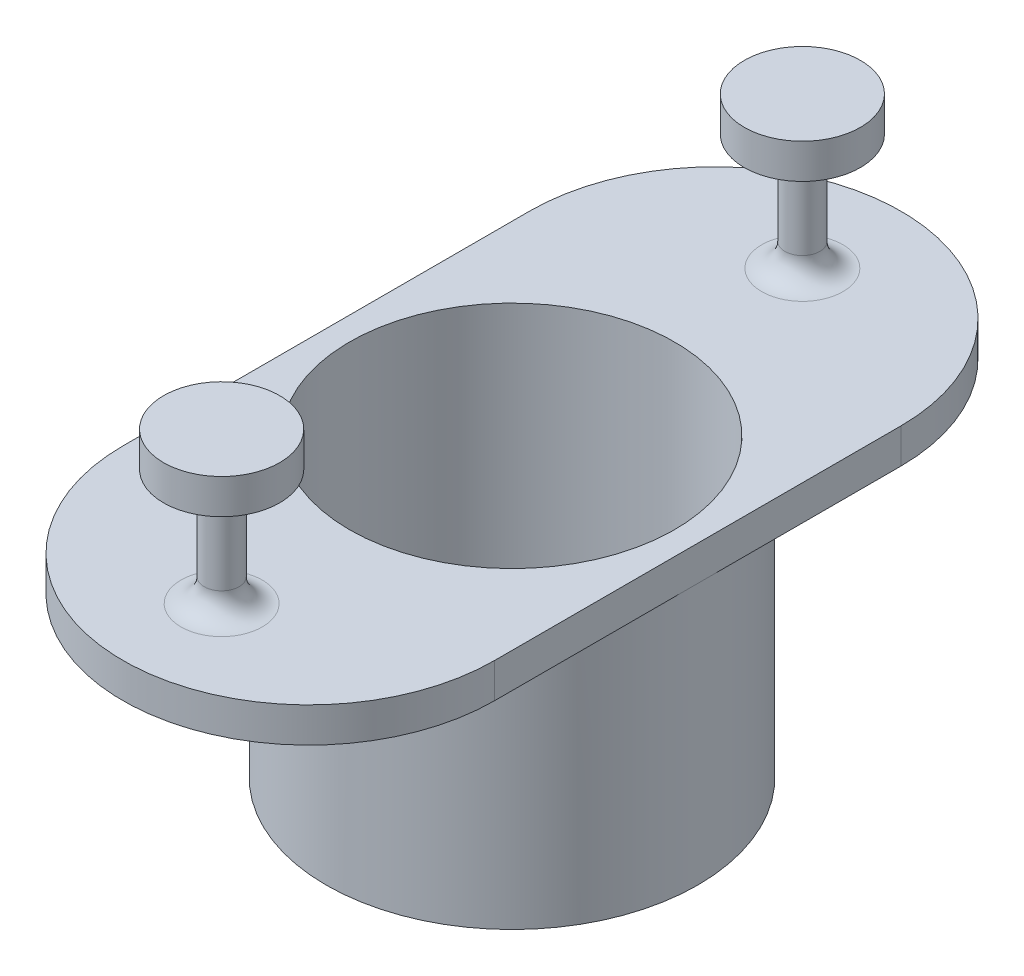
ISO-10303-21;
HEADER;
FILE_DESCRIPTION(('STEP AP214'),'2;1');
FILE_NAME('part.step','',(''),(''),'','','');
FILE_SCHEMA(('AUTOMOTIVE_DESIGN { 1 0 10303 214 1 1 1 1 }'));
ENDSEC;
DATA;
#1=APPLICATION_CONTEXT('core data for automotive mechanical design processes');
#2=APPLICATION_PROTOCOL_DEFINITION('international standard','automotive_design',2000,#1);
#3=PRODUCT_CONTEXT('',#1,'mechanical');
#4=PRODUCT('Part','Part','',(#3));
#5=PRODUCT_RELATED_PRODUCT_CATEGORY('part','',(#4));
#6=PRODUCT_DEFINITION_FORMATION('','',#4);
#7=PRODUCT_DEFINITION_CONTEXT('part definition',#1,'design');
#8=PRODUCT_DEFINITION('design','',#6,#7);
#9=PRODUCT_DEFINITION_SHAPE('','',#8);
#10=(LENGTH_UNIT() NAMED_UNIT(*) SI_UNIT(.MILLI.,.METRE.));
#11=(NAMED_UNIT(*) PLANE_ANGLE_UNIT() SI_UNIT($,.RADIAN.));
#12=(NAMED_UNIT(*) SI_UNIT($,.STERADIAN.) SOLID_ANGLE_UNIT());
#13=UNCERTAINTY_MEASURE_WITH_UNIT(LENGTH_MEASURE(1.E-05),#10,'distance_accuracy_value','');
#14=(GEOMETRIC_REPRESENTATION_CONTEXT(3) GLOBAL_UNCERTAINTY_ASSIGNED_CONTEXT((#13)) GLOBAL_UNIT_ASSIGNED_CONTEXT((#10,
#11,#12)) REPRESENTATION_CONTEXT('',''));
#15=CARTESIAN_POINT('',(0.,0.,0.));
#16=DIRECTION('',(0.,0.,1.));
#17=DIRECTION('',(1.,0.,0.));
#18=AXIS2_PLACEMENT_3D('',#15,#16,#17);
#19=CARTESIAN_POINT('',(0.,22.5,0.));
#20=DIRECTION('',(0.,-1.,0.));
#21=DIRECTION('',(0.,0.,-1.));
#22=AXIS2_PLACEMENT_3D('',#19,#20,#21);
#23=CYLINDRICAL_SURFACE('',#22,16.);
#24=CARTESIAN_POINT('',(0.,22.5,0.));
#25=DIRECTION('',(0.,1.,0.));
#26=DIRECTION('',(0.,0.,1.));
#27=AXIS2_PLACEMENT_3D('',#24,#25,#26);
#28=CIRCLE('',#27,16.);
#29=CARTESIAN_POINT('',(16.,22.5,0.));
#30=VERTEX_POINT('',#29);
#31=CARTESIAN_POINT('',(-16.,22.5,0.));
#32=VERTEX_POINT('',#31);
#33=EDGE_CURVE('E60',#30,#32,#28,.T.);
#34=ORIENTED_EDGE('',*,*,#33,.F.);
#35=EDGE_CURVE('E57',#32,#30,#28,.T.);
#36=ORIENTED_EDGE('',*,*,#35,.F.);
#37=EDGE_LOOP('',(#34,#36));
#38=FACE_BOUND('',#37,.T.);
#39=CARTESIAN_POINT('',(0.,0.,0.));
#40=DIRECTION('',(0.,1.,0.));
#41=DIRECTION('',(0.,0.,1.));
#42=AXIS2_PLACEMENT_3D('',#39,#40,#41);
#43=CIRCLE('',#42,16.);
#44=CARTESIAN_POINT('',(0.,0.,16.));
#45=VERTEX_POINT('',#44);
#46=EDGE_CURVE('E113',#45,#45,#43,.T.);
#47=ORIENTED_EDGE('',*,*,#46,.T.);
#48=EDGE_LOOP('',(#47));
#49=FACE_BOUND('',#48,.T.);
#50=ADVANCED_FACE('F43',(#38,#49),#23,.T.);
#51=CARTESIAN_POINT('',(0.,0.,0.));
#52=DIRECTION('',(0.,1.,0.));
#53=DIRECTION('',(0.,0.,1.));
#54=AXIS2_PLACEMENT_3D('',#51,#52,#53);
#55=PLANE('',#54);
#56=CARTESIAN_POINT('',(8.,0.,0.));
#57=DIRECTION('',(0.,1.,0.));
#58=DIRECTION('',(0.,0.,1.));
#59=AXIS2_PLACEMENT_3D('',#56,#57,#58);
#60=CIRCLE('',#59,1.5);
#61=CARTESIAN_POINT('',(8.,0.,1.5));
#62=VERTEX_POINT('',#61);
#63=EDGE_CURVE('E454',#62,#62,#60,.T.);
#64=ORIENTED_EDGE('',*,*,#63,.T.);
#65=EDGE_LOOP('',(#64));
#66=FACE_BOUND('',#65,.T.);
#67=CARTESIAN_POINT('',(-8.,0.,0.));
#68=DIRECTION('',(0.,1.,0.));
#69=DIRECTION('',(0.,0.,1.));
#70=AXIS2_PLACEMENT_3D('',#67,#68,#69);
#71=CIRCLE('',#70,1.5);
#72=CARTESIAN_POINT('',(-8.,0.,1.5));
#73=VERTEX_POINT('',#72);
#74=EDGE_CURVE('E458',#73,#73,#71,.T.);
#75=ORIENTED_EDGE('',*,*,#74,.T.);
#76=EDGE_LOOP('',(#75));
#77=FACE_BOUND('',#76,.T.);
#78=ORIENTED_EDGE('',*,*,#46,.F.);
#79=EDGE_LOOP('',(#78));
#80=FACE_BOUND('',#79,.T.);
#81=ADVANCED_FACE('F165',(#66,#77,#80),#55,.F.);
#82=CARTESIAN_POINT('',(0.,22.5,17.5));
#83=DIRECTION('',(0.,1.,0.));
#84=DIRECTION('',(0.,0.,1.));
#85=AXIS2_PLACEMENT_3D('',#82,#83,#84);
#86=PLANE('',#85);
#87=DIRECTION('',(0.,0.,-1.));
#88=VECTOR('',#87,1.);
#89=CARTESIAN_POINT('',(16.,22.5,17.5));
#90=LINE('',#89,#88);
#91=CARTESIAN_POINT('',(16.,22.5,-17.5));
#92=VERTEX_POINT('',#91);
#93=EDGE_CURVE('E430',#30,#92,#90,.T.);
#94=ORIENTED_EDGE('',*,*,#93,.F.);
#95=ORIENTED_EDGE('',*,*,#33,.T.);
#96=DIRECTION('',(0.,0.,1.));
#97=VECTOR('',#96,1.);
#98=CARTESIAN_POINT('',(-16.,22.5,17.5));
#99=LINE('',#98,#97);
#100=CARTESIAN_POINT('',(-16.,22.5,-17.5));
#101=VERTEX_POINT('',#100);
#102=EDGE_CURVE('E108',#101,#32,#99,.T.);
#103=ORIENTED_EDGE('',*,*,#102,.F.);
#104=CARTESIAN_POINT('',(0.,22.5,-17.5));
#105=DIRECTION('',(0.,1.,0.));
#106=DIRECTION('',(0.,0.,1.));
#107=AXIS2_PLACEMENT_3D('',#104,#105,#106);
#108=CIRCLE('',#107,16.);
#109=EDGE_CURVE('E433',#92,#101,#108,.T.);
#110=ORIENTED_EDGE('',*,*,#109,.F.);
#111=EDGE_LOOP('',(#94,#95,#103,#110));
#112=FACE_BOUND('',#111,.T.);
#113=ADVANCED_FACE('F170',(#112),#86,.F.);
#114=CARTESIAN_POINT('',(-16.,22.5,17.5));
#115=VERTEX_POINT('',#114);
#116=EDGE_CURVE('E436',#32,#115,#99,.T.);
#117=ORIENTED_EDGE('',*,*,#116,.F.);
#118=ORIENTED_EDGE('',*,*,#35,.T.);
#119=CARTESIAN_POINT('',(16.,22.5,17.5));
#120=VERTEX_POINT('',#119);
#121=EDGE_CURVE('E434',#120,#30,#90,.T.);
#122=ORIENTED_EDGE('',*,*,#121,.F.);
#123=CARTESIAN_POINT('',(0.,22.5,17.5));
#124=DIRECTION('',(0.,1.,0.));
#125=DIRECTION('',(0.,0.,1.));
#126=AXIS2_PLACEMENT_3D('',#123,#124,#125);
#127=CIRCLE('',#126,16.);
#128=EDGE_CURVE('E112',#115,#120,#127,.T.);
#129=ORIENTED_EDGE('',*,*,#128,.F.);
#130=EDGE_LOOP('',(#117,#118,#122,#129));
#131=FACE_BOUND('',#130,.T.);
#132=ADVANCED_FACE('F387',(#131),#86,.F.);
#133=CARTESIAN_POINT('',(0.,25.5,17.5));
#134=DIRECTION('',(0.,-1.,0.));
#135=DIRECTION('',(0.,0.,-1.));
#136=AXIS2_PLACEMENT_3D('',#133,#134,#135);
#137=CYLINDRICAL_SURFACE('',#136,16.);
#138=ORIENTED_EDGE('',*,*,#128,.T.);
#139=DIRECTION('',(0.,-1.,0.));
#140=VECTOR('',#139,1.);
#141=CARTESIAN_POINT('',(16.,25.5,17.5));
#142=LINE('',#141,#140);
#143=CARTESIAN_POINT('',(16.,25.5,17.5));
#144=VERTEX_POINT('',#143);
#145=EDGE_CURVE('E92',#144,#120,#142,.T.);
#146=ORIENTED_EDGE('',*,*,#145,.F.);
#147=CARTESIAN_POINT('',(0.,25.5,17.5));
#148=DIRECTION('',(0.,1.,0.));
#149=DIRECTION('',(0.,0.,1.));
#150=AXIS2_PLACEMENT_3D('',#147,#148,#149);
#151=CIRCLE('',#150,16.);
#152=CARTESIAN_POINT('',(-16.,25.5,17.5));
#153=VERTEX_POINT('',#152);
#154=EDGE_CURVE('E99',#153,#144,#151,.T.);
#155=ORIENTED_EDGE('',*,*,#154,.F.);
#156=DIRECTION('',(0.,-1.,0.));
#157=VECTOR('',#156,1.);
#158=CARTESIAN_POINT('',(-16.,25.5,17.5));
#159=LINE('',#158,#157);
#160=EDGE_CURVE('E443',#153,#115,#159,.T.);
#161=ORIENTED_EDGE('',*,*,#160,.T.);
#162=EDGE_LOOP('',(#138,#146,#155,#161));
#163=FACE_BOUND('',#162,.T.);
#164=ADVANCED_FACE('F110',(#163),#137,.T.);
#165=CARTESIAN_POINT('',(16.,25.5,17.5));
#166=DIRECTION('',(-1.,0.,0.));
#167=DIRECTION('',(0.,0.,1.));
#168=AXIS2_PLACEMENT_3D('',#165,#166,#167);
#169=PLANE('',#168);
#170=ORIENTED_EDGE('',*,*,#121,.T.);
#171=ORIENTED_EDGE('',*,*,#93,.T.);
#172=DIRECTION('',(0.,-1.,0.));
#173=VECTOR('',#172,1.);
#174=CARTESIAN_POINT('',(16.,25.5,-17.5));
#175=LINE('',#174,#173);
#176=CARTESIAN_POINT('',(16.,25.5,-17.5));
#177=VERTEX_POINT('',#176);
#178=EDGE_CURVE('E95',#177,#92,#175,.T.);
#179=ORIENTED_EDGE('',*,*,#178,.F.);
#180=DIRECTION('',(0.,0.,-1.));
#181=VECTOR('',#180,1.);
#182=CARTESIAN_POINT('',(16.,25.5,17.5));
#183=LINE('',#182,#181);
#184=EDGE_CURVE('E87',#144,#177,#183,.T.);
#185=ORIENTED_EDGE('',*,*,#184,.F.);
#186=ORIENTED_EDGE('',*,*,#145,.T.);
#187=EDGE_LOOP('',(#170,#171,#179,#185,#186));
#188=FACE_BOUND('',#187,.T.);
#189=ADVANCED_FACE('F90',(#188),#169,.F.);
#190=CARTESIAN_POINT('',(0.,25.5,-17.5));
#191=DIRECTION('',(0.,-1.,0.));
#192=DIRECTION('',(0.,0.,-1.));
#193=AXIS2_PLACEMENT_3D('',#190,#191,#192);
#194=CYLINDRICAL_SURFACE('',#193,16.);
#195=ORIENTED_EDGE('',*,*,#109,.T.);
#196=DIRECTION('',(0.,-1.,0.));
#197=VECTOR('',#196,1.);
#198=CARTESIAN_POINT('',(-16.,25.5,-17.5));
#199=LINE('',#198,#197);
#200=CARTESIAN_POINT('',(-16.,25.5,-17.5));
#201=VERTEX_POINT('',#200);
#202=EDGE_CURVE('E117',#201,#101,#199,.T.);
#203=ORIENTED_EDGE('',*,*,#202,.F.);
#204=CARTESIAN_POINT('',(0.,25.5,-17.5));
#205=DIRECTION('',(0.,1.,0.));
#206=DIRECTION('',(0.,0.,1.));
#207=AXIS2_PLACEMENT_3D('',#204,#205,#206);
#208=CIRCLE('',#207,16.);
#209=EDGE_CURVE('E98',#177,#201,#208,.T.);
#210=ORIENTED_EDGE('',*,*,#209,.F.);
#211=ORIENTED_EDGE('',*,*,#178,.T.);
#212=EDGE_LOOP('',(#195,#203,#210,#211));
#213=FACE_BOUND('',#212,.T.);
#214=ADVANCED_FACE('F357',(#213),#194,.T.);
#215=CARTESIAN_POINT('',(-16.,25.5,17.5));
#216=DIRECTION('',(1.,0.,0.));
#217=DIRECTION('',(0.,0.,-1.));
#218=AXIS2_PLACEMENT_3D('',#215,#216,#217);
#219=PLANE('',#218);
#220=ORIENTED_EDGE('',*,*,#102,.T.);
#221=ORIENTED_EDGE('',*,*,#116,.T.);
#222=ORIENTED_EDGE('',*,*,#160,.F.);
#223=DIRECTION('',(0.,0.,1.));
#224=VECTOR('',#223,1.);
#225=CARTESIAN_POINT('',(-16.,25.5,17.5));
#226=LINE('',#225,#224);
#227=EDGE_CURVE('E104',#201,#153,#226,.T.);
#228=ORIENTED_EDGE('',*,*,#227,.F.);
#229=ORIENTED_EDGE('',*,*,#202,.T.);
#230=EDGE_LOOP('',(#220,#221,#222,#228,#229));
#231=FACE_BOUND('',#230,.T.);
#232=ADVANCED_FACE('F161',(#231),#219,.F.);
#233=CARTESIAN_POINT('',(0.,25.5,17.5));
#234=DIRECTION('',(0.,1.,0.));
#235=DIRECTION('',(0.,0.,1.));
#236=AXIS2_PLACEMENT_3D('',#233,#234,#235);
#237=PLANE('',#236);
#238=CARTESIAN_POINT('',(0.,25.5,25.));
#239=DIRECTION('',(0.,1.,0.));
#240=DIRECTION('',(0.,0.,1.));
#241=AXIS2_PLACEMENT_3D('',#238,#239,#240);
#242=CIRCLE('',#241,3.5);
#243=CARTESIAN_POINT('',(0.,25.5,28.5));
#244=VERTEX_POINT('',#243);
#245=EDGE_CURVE('E12',#244,#244,#242,.F.);
#246=ORIENTED_EDGE('',*,*,#245,.T.);
#247=EDGE_LOOP('',(#246));
#248=FACE_BOUND('',#247,.T.);
#249=CARTESIAN_POINT('',(0.,25.5,-25.));
#250=DIRECTION('',(0.,1.,0.));
#251=DIRECTION('',(0.,0.,1.));
#252=AXIS2_PLACEMENT_3D('',#249,#250,#251);
#253=CIRCLE('',#252,3.50000000000001);
#254=CARTESIAN_POINT('',(0.,25.5,-21.5));
#255=VERTEX_POINT('',#254);
#256=EDGE_CURVE('E51',#255,#255,#253,.F.);
#257=ORIENTED_EDGE('',*,*,#256,.T.);
#258=EDGE_LOOP('',(#257));
#259=FACE_BOUND('',#258,.T.);
#260=CARTESIAN_POINT('',(0.,25.5,0.));
#261=DIRECTION('',(0.,1.,0.));
#262=DIRECTION('',(0.,0.,1.));
#263=AXIS2_PLACEMENT_3D('',#260,#261,#262);
#264=CIRCLE('',#263,14.);
#265=CARTESIAN_POINT('',(0.,25.5,14.));
#266=VERTEX_POINT('',#265);
#267=EDGE_CURVE('E451',#266,#266,#264,.T.);
#268=ORIENTED_EDGE('',*,*,#267,.F.);
#269=EDGE_LOOP('',(#268));
#270=FACE_BOUND('',#269,.T.);
#271=ORIENTED_EDGE('',*,*,#154,.T.);
#272=ORIENTED_EDGE('',*,*,#184,.T.);
#273=ORIENTED_EDGE('',*,*,#209,.T.);
#274=ORIENTED_EDGE('',*,*,#227,.T.);
#275=EDGE_LOOP('',(#271,#272,#273,#274));
#276=FACE_BOUND('',#275,.T.);
#277=ADVANCED_FACE('F102',(#248,#259,#270,#276),#237,.T.);
#278=CARTESIAN_POINT('',(0.,35.5,-25.));
#279=DIRECTION('',(0.,-1.,0.));
#280=DIRECTION('',(0.,0.,-1.));
#281=AXIS2_PLACEMENT_3D('',#278,#279,#280);
#282=CYLINDRICAL_SURFACE('',#281,1.50000000000001);
#283=CARTESIAN_POINT('',(0.,33.5,-25.));
#284=DIRECTION('',(0.,1.,0.));
#285=DIRECTION('',(0.,0.,1.));
#286=AXIS2_PLACEMENT_3D('',#283,#284,#285);
#287=CIRCLE('',#286,1.50000000000001);
#288=CARTESIAN_POINT('',(0.,33.5,-23.5));
#289=VERTEX_POINT('',#288);
#290=EDGE_CURVE('E128',#289,#289,#287,.F.);
#291=ORIENTED_EDGE('',*,*,#290,.T.);
#292=EDGE_LOOP('',(#291));
#293=FACE_BOUND('',#292,.T.);
#294=CARTESIAN_POINT('',(0.,27.5,-25.));
#295=DIRECTION('',(0.,1.,0.));
#296=DIRECTION('',(0.,0.,1.));
#297=AXIS2_PLACEMENT_3D('',#294,#295,#296);
#298=CIRCLE('',#297,1.50000000000001);
#299=CARTESIAN_POINT('',(0.,27.5,-23.5));
#300=VERTEX_POINT('',#299);
#301=EDGE_CURVE('E125',#300,#300,#298,.T.);
#302=ORIENTED_EDGE('',*,*,#301,.T.);
#303=EDGE_LOOP('',(#302));
#304=FACE_BOUND('',#303,.T.);
#305=ADVANCED_FACE('F149',(#293,#304),#282,.T.);
#306=CARTESIAN_POINT('',(0.,35.5,25.));
#307=DIRECTION('',(0.,-1.,0.));
#308=DIRECTION('',(0.,0.,-1.));
#309=AXIS2_PLACEMENT_3D('',#306,#307,#308);
#310=CYLINDRICAL_SURFACE('',#309,1.5);
#311=CARTESIAN_POINT('',(0.,33.5,25.));
#312=DIRECTION('',(0.,1.,0.));
#313=DIRECTION('',(0.,0.,1.));
#314=AXIS2_PLACEMENT_3D('',#311,#312,#313);
#315=CIRCLE('',#314,1.5);
#316=CARTESIAN_POINT('',(0.,33.5,26.5));
#317=VERTEX_POINT('',#316);
#318=EDGE_CURVE('E137',#317,#317,#315,.F.);
#319=ORIENTED_EDGE('',*,*,#318,.T.);
#320=EDGE_LOOP('',(#319));
#321=FACE_BOUND('',#320,.T.);
#322=CARTESIAN_POINT('',(0.,27.5,25.));
#323=DIRECTION('',(0.,1.,0.));
#324=DIRECTION('',(0.,0.,1.));
#325=AXIS2_PLACEMENT_3D('',#322,#323,#324);
#326=CIRCLE('',#325,1.5);
#327=CARTESIAN_POINT('',(0.,27.5,26.5));
#328=VERTEX_POINT('',#327);
#329=EDGE_CURVE('E134',#328,#328,#326,.T.);
#330=ORIENTED_EDGE('',*,*,#329,.T.);
#331=EDGE_LOOP('',(#330));
#332=FACE_BOUND('',#331,.T.);
#333=ADVANCED_FACE('F151',(#321,#332),#310,.T.);
#334=CARTESIAN_POINT('',(0.,-39.5979797464467,0.));
#335=DIRECTION('',(0.,1.,0.));
#336=DIRECTION('',(0.,0.,1.));
#337=AXIS2_PLACEMENT_3D('',#334,#335,#336);
#338=CYLINDRICAL_SURFACE('',#337,14.);
#339=CARTESIAN_POINT('',(0.,2.,0.));
#340=DIRECTION('',(0.,1.,0.));
#341=DIRECTION('',(0.,0.,1.));
#342=AXIS2_PLACEMENT_3D('',#339,#340,#341);
#343=CIRCLE('',#342,14.);
#344=CARTESIAN_POINT('',(0.,2.,14.));
#345=VERTEX_POINT('',#344);
#346=EDGE_CURVE('E448',#345,#345,#343,.F.);
#347=ORIENTED_EDGE('',*,*,#346,.T.);
#348=EDGE_LOOP('',(#347));
#349=FACE_BOUND('',#348,.T.);
#350=ORIENTED_EDGE('',*,*,#267,.T.);
#351=EDGE_LOOP('',(#350));
#352=FACE_BOUND('',#351,.T.);
#353=ADVANCED_FACE('F158',(#349,#352),#338,.F.);
#354=CARTESIAN_POINT('',(0.,2.,0.));
#355=DIRECTION('',(0.,1.,0.));
#356=DIRECTION('',(0.,0.,1.));
#357=AXIS2_PLACEMENT_3D('',#354,#355,#356);
#358=PLANE('',#357);
#359=CARTESIAN_POINT('',(8.,2.,0.));
#360=DIRECTION('',(0.,1.,0.));
#361=DIRECTION('',(0.,0.,1.));
#362=AXIS2_PLACEMENT_3D('',#359,#360,#361);
#363=CIRCLE('',#362,1.5);
#364=CARTESIAN_POINT('',(8.,2.,1.5));
#365=VERTEX_POINT('',#364);
#366=EDGE_CURVE('E462',#365,#365,#363,.T.);
#367=ORIENTED_EDGE('',*,*,#366,.F.);
#368=EDGE_LOOP('',(#367));
#369=FACE_BOUND('',#368,.T.);
#370=CARTESIAN_POINT('',(-8.,2.,0.));
#371=DIRECTION('',(0.,1.,0.));
#372=DIRECTION('',(0.,0.,1.));
#373=AXIS2_PLACEMENT_3D('',#370,#371,#372);
#374=CIRCLE('',#373,1.5);
#375=CARTESIAN_POINT('',(-8.,2.,1.5));
#376=VERTEX_POINT('',#375);
#377=EDGE_CURVE('E455',#376,#376,#374,.T.);
#378=ORIENTED_EDGE('',*,*,#377,.F.);
#379=EDGE_LOOP('',(#378));
#380=FACE_BOUND('',#379,.T.);
#381=ORIENTED_EDGE('',*,*,#346,.F.);
#382=EDGE_LOOP('',(#381));
#383=FACE_BOUND('',#382,.T.);
#384=ADVANCED_FACE('F307',(#369,#380,#383),#358,.T.);
#385=CARTESIAN_POINT('',(-8.,0.,0.));
#386=DIRECTION('',(0.,1.,0.));
#387=DIRECTION('',(0.,0.,1.));
#388=AXIS2_PLACEMENT_3D('',#385,#386,#387);
#389=CYLINDRICAL_SURFACE('',#388,1.5);
#390=ORIENTED_EDGE('',*,*,#74,.F.);
#391=EDGE_LOOP('',(#390));
#392=FACE_BOUND('',#391,.T.);
#393=ORIENTED_EDGE('',*,*,#377,.T.);
#394=EDGE_LOOP('',(#393));
#395=FACE_BOUND('',#394,.T.);
#396=ADVANCED_FACE('F296',(#392,#395),#389,.F.);
#397=CARTESIAN_POINT('',(8.,0.,0.));
#398=DIRECTION('',(0.,1.,0.));
#399=DIRECTION('',(0.,0.,1.));
#400=AXIS2_PLACEMENT_3D('',#397,#398,#399);
#401=CYLINDRICAL_SURFACE('',#400,1.5);
#402=ORIENTED_EDGE('',*,*,#63,.F.);
#403=EDGE_LOOP('',(#402));
#404=FACE_BOUND('',#403,.T.);
#405=ORIENTED_EDGE('',*,*,#366,.T.);
#406=EDGE_LOOP('',(#405));
#407=FACE_BOUND('',#406,.T.);
#408=ADVANCED_FACE('F285',(#404,#407),#401,.F.);
#409=CARTESIAN_POINT('',(0.,38.5,-25.));
#410=DIRECTION('',(0.,-1.,0.));
#411=DIRECTION('',(0.,0.,-1.));
#412=AXIS2_PLACEMENT_3D('',#409,#410,#411);
#413=CYLINDRICAL_SURFACE('',#412,5.);
#414=CARTESIAN_POINT('',(0.,38.5,-25.));
#415=DIRECTION('',(0.,1.,0.));
#416=DIRECTION('',(0.,0.,1.));
#417=AXIS2_PLACEMENT_3D('',#414,#415,#416);
#418=CIRCLE('',#417,5.);
#419=CARTESIAN_POINT('',(0.,38.5,-20.));
#420=VERTEX_POINT('',#419);
#421=EDGE_CURVE('E459',#420,#420,#418,.T.);
#422=ORIENTED_EDGE('',*,*,#421,.F.);
#423=EDGE_LOOP('',(#422));
#424=FACE_BOUND('',#423,.T.);
#425=CARTESIAN_POINT('',(0.,35.5,-25.));
#426=DIRECTION('',(0.,1.,0.));
#427=DIRECTION('',(0.,0.,1.));
#428=AXIS2_PLACEMENT_3D('',#425,#426,#427);
#429=CIRCLE('',#428,5.);
#430=CARTESIAN_POINT('',(0.,35.5,-20.));
#431=VERTEX_POINT('',#430);
#432=EDGE_CURVE('E467',#431,#431,#429,.T.);
#433=ORIENTED_EDGE('',*,*,#432,.T.);
#434=EDGE_LOOP('',(#433));
#435=FACE_BOUND('',#434,.T.);
#436=ADVANCED_FACE('F274',(#424,#435),#413,.T.);
#437=CARTESIAN_POINT('',(0.,38.5,-25.));
#438=DIRECTION('',(0.,1.,0.));
#439=DIRECTION('',(0.,0.,1.));
#440=AXIS2_PLACEMENT_3D('',#437,#438,#439);
#441=PLANE('',#440);
#442=ORIENTED_EDGE('',*,*,#421,.T.);
#443=EDGE_LOOP('',(#442));
#444=FACE_BOUND('',#443,.T.);
#445=ADVANCED_FACE('F263',(#444),#441,.T.);
#446=CARTESIAN_POINT('',(0.,35.5,-25.));
#447=DIRECTION('',(0.,1.,0.));
#448=DIRECTION('',(0.,0.,1.));
#449=AXIS2_PLACEMENT_3D('',#446,#447,#448);
#450=PLANE('',#449);
#451=CARTESIAN_POINT('',(0.,35.5,-25.));
#452=DIRECTION('',(0.,1.,0.));
#453=DIRECTION('',(0.,0.,1.));
#454=AXIS2_PLACEMENT_3D('',#451,#452,#453);
#455=CIRCLE('',#454,3.50000000000001);
#456=CARTESIAN_POINT('',(0.,35.5,-21.5));
#457=VERTEX_POINT('',#456);
#458=EDGE_CURVE('E121',#457,#457,#455,.T.);
#459=ORIENTED_EDGE('',*,*,#458,.T.);
#460=EDGE_LOOP('',(#459));
#461=FACE_BOUND('',#460,.T.);
#462=ORIENTED_EDGE('',*,*,#432,.F.);
#463=EDGE_LOOP('',(#462));
#464=FACE_BOUND('',#463,.T.);
#465=ADVANCED_FACE('F252',(#461,#464),#450,.F.);
#466=CARTESIAN_POINT('',(0.,38.5,25.));
#467=DIRECTION('',(0.,-1.,0.));
#468=DIRECTION('',(0.,0.,-1.));
#469=AXIS2_PLACEMENT_3D('',#466,#467,#468);
#470=CYLINDRICAL_SURFACE('',#469,5.);
#471=CARTESIAN_POINT('',(0.,38.5,25.));
#472=DIRECTION('',(0.,1.,0.));
#473=DIRECTION('',(0.,0.,1.));
#474=AXIS2_PLACEMENT_3D('',#471,#472,#473);
#475=CIRCLE('',#474,5.);
#476=CARTESIAN_POINT('',(0.,38.5,30.));
#477=VERTEX_POINT('',#476);
#478=EDGE_CURVE('E473',#477,#477,#475,.T.);
#479=ORIENTED_EDGE('',*,*,#478,.F.);
#480=EDGE_LOOP('',(#479));
#481=FACE_BOUND('',#480,.T.);
#482=CARTESIAN_POINT('',(0.,35.5,25.));
#483=DIRECTION('',(0.,1.,0.));
#484=DIRECTION('',(0.,0.,1.));
#485=AXIS2_PLACEMENT_3D('',#482,#483,#484);
#486=CIRCLE('',#485,5.);
#487=CARTESIAN_POINT('',(0.,35.5,30.));
#488=VERTEX_POINT('',#487);
#489=EDGE_CURVE('E470',#488,#488,#486,.T.);
#490=ORIENTED_EDGE('',*,*,#489,.T.);
#491=EDGE_LOOP('',(#490));
#492=FACE_BOUND('',#491,.T.);
#493=ADVANCED_FACE('F240',(#481,#492),#470,.T.);
#494=CARTESIAN_POINT('',(0.,38.5,25.));
#495=DIRECTION('',(0.,1.,0.));
#496=DIRECTION('',(0.,0.,1.));
#497=AXIS2_PLACEMENT_3D('',#494,#495,#496);
#498=PLANE('',#497);
#499=ORIENTED_EDGE('',*,*,#478,.T.);
#500=EDGE_LOOP('',(#499));
#501=FACE_BOUND('',#500,.T.);
#502=ADVANCED_FACE('F228',(#501),#498,.T.);
#503=CARTESIAN_POINT('',(0.,35.5,25.));
#504=DIRECTION('',(0.,1.,0.));
#505=DIRECTION('',(0.,0.,1.));
#506=AXIS2_PLACEMENT_3D('',#503,#504,#505);
#507=PLANE('',#506);
#508=CARTESIAN_POINT('',(0.,35.5,25.));
#509=DIRECTION('',(0.,1.,0.));
#510=DIRECTION('',(0.,0.,1.));
#511=AXIS2_PLACEMENT_3D('',#508,#509,#510);
#512=CIRCLE('',#511,3.5);
#513=CARTESIAN_POINT('',(0.,35.5,28.5));
#514=VERTEX_POINT('',#513);
#515=EDGE_CURVE('E131',#514,#514,#512,.T.);
#516=ORIENTED_EDGE('',*,*,#515,.T.);
#517=EDGE_LOOP('',(#516));
#518=FACE_BOUND('',#517,.T.);
#519=ORIENTED_EDGE('',*,*,#489,.F.);
#520=EDGE_LOOP('',(#519));
#521=FACE_BOUND('',#520,.T.);
#522=ADVANCED_FACE('F180',(#518,#521),#507,.F.);
#523=CARTESIAN_POINT('',(0.,33.5,-25.));
#524=DIRECTION('',(0.,1.,0.));
#525=DIRECTION('',(0.,0.,1.));
#526=AXIS2_PLACEMENT_3D('',#523,#524,#525);
#527=TOROIDAL_SURFACE('',#526,3.50000000000001,2.);
#528=ORIENTED_EDGE('',*,*,#290,.F.);
#529=EDGE_LOOP('',(#528));
#530=FACE_BOUND('',#529,.T.);
#531=ORIENTED_EDGE('',*,*,#458,.F.);
#532=EDGE_LOOP('',(#531));
#533=FACE_BOUND('',#532,.T.);
#534=ADVANCED_FACE('F176',(#530,#533),#527,.F.);
#535=CARTESIAN_POINT('',(0.,33.5,25.));
#536=DIRECTION('',(0.,1.,0.));
#537=DIRECTION('',(0.,0.,1.));
#538=AXIS2_PLACEMENT_3D('',#535,#536,#537);
#539=TOROIDAL_SURFACE('',#538,3.5,2.);
#540=ORIENTED_EDGE('',*,*,#318,.F.);
#541=EDGE_LOOP('',(#540));
#542=FACE_BOUND('',#541,.T.);
#543=ORIENTED_EDGE('',*,*,#515,.F.);
#544=EDGE_LOOP('',(#543));
#545=FACE_BOUND('',#544,.T.);
#546=ADVANCED_FACE('F179',(#542,#545),#539,.F.);
#547=CARTESIAN_POINT('',(0.,27.5,25.));
#548=DIRECTION('',(0.,1.,0.));
#549=DIRECTION('',(0.,0.,1.));
#550=AXIS2_PLACEMENT_3D('',#547,#548,#549);
#551=TOROIDAL_SURFACE('',#550,3.5,2.);
#552=ORIENTED_EDGE('',*,*,#245,.F.);
#553=EDGE_LOOP('',(#552));
#554=FACE_BOUND('',#553,.T.);
#555=ORIENTED_EDGE('',*,*,#329,.F.);
#556=EDGE_LOOP('',(#555));
#557=FACE_BOUND('',#556,.T.);
#558=ADVANCED_FACE('F146',(#554,#557),#551,.F.);
#559=CARTESIAN_POINT('',(0.,27.5,-25.));
#560=DIRECTION('',(0.,1.,0.));
#561=DIRECTION('',(0.,0.,1.));
#562=AXIS2_PLACEMENT_3D('',#559,#560,#561);
#563=TOROIDAL_SURFACE('',#562,3.50000000000001,2.);
#564=ORIENTED_EDGE('',*,*,#256,.F.);
#565=EDGE_LOOP('',(#564));
#566=FACE_BOUND('',#565,.T.);
#567=ORIENTED_EDGE('',*,*,#301,.F.);
#568=EDGE_LOOP('',(#567));
#569=FACE_BOUND('',#568,.T.);
#570=ADVANCED_FACE('F45',(#566,#569),#563,.F.);
#571=CLOSED_SHELL('',(#50,#81,#113,#132,#164,#189,#214,#232,#277,#305,#333,#353,#384,#396,#408,
#436,#445,#465,#493,#502,#522,#534,#546,#558,#570));
#572=MANIFOLD_SOLID_BREP('B2',#571);
#573=ADVANCED_BREP_SHAPE_REPRESENTATION('',(#18,#572),#14);
#574=SHAPE_DEFINITION_REPRESENTATION(#9,#573);
ENDSEC;
END-ISO-10303-21;
